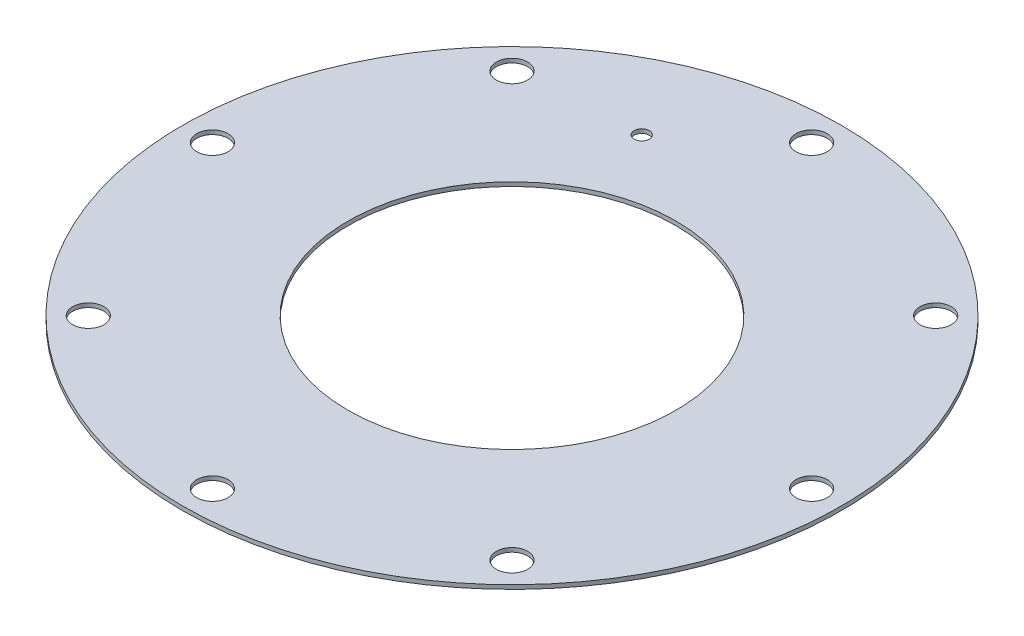
ISO-10303-21;
HEADER;
FILE_DESCRIPTION(('STEP AP214'),'2;1');
FILE_NAME('part.step','',(''),(''),'','','');
FILE_SCHEMA(('AUTOMOTIVE_DESIGN { 1 0 10303 214 1 1 1 1 }'));
ENDSEC;
DATA;
#1=APPLICATION_CONTEXT('core data for automotive mechanical design processes');
#2=APPLICATION_PROTOCOL_DEFINITION('international standard','automotive_design',2000,#1);
#3=PRODUCT_CONTEXT('',#1,'mechanical');
#4=PRODUCT('Part','Part','',(#3));
#5=PRODUCT_RELATED_PRODUCT_CATEGORY('part','',(#4));
#6=PRODUCT_DEFINITION_FORMATION('','',#4);
#7=PRODUCT_DEFINITION_CONTEXT('part definition',#1,'design');
#8=PRODUCT_DEFINITION('design','',#6,#7);
#9=PRODUCT_DEFINITION_SHAPE('','',#8);
#10=(LENGTH_UNIT() NAMED_UNIT(*) SI_UNIT(.MILLI.,.METRE.));
#11=(NAMED_UNIT(*) PLANE_ANGLE_UNIT() SI_UNIT($,.RADIAN.));
#12=(NAMED_UNIT(*) SI_UNIT($,.STERADIAN.) SOLID_ANGLE_UNIT());
#13=UNCERTAINTY_MEASURE_WITH_UNIT(LENGTH_MEASURE(1.E-05),#10,'distance_accuracy_value','');
#14=(GEOMETRIC_REPRESENTATION_CONTEXT(3) GLOBAL_UNCERTAINTY_ASSIGNED_CONTEXT((#13)) GLOBAL_UNIT_ASSIGNED_CONTEXT((#10,
#11,#12)) REPRESENTATION_CONTEXT('',''));
#15=CARTESIAN_POINT('',(0.,0.,0.));
#16=DIRECTION('',(0.,0.,1.));
#17=DIRECTION('',(1.,0.,0.));
#18=AXIS2_PLACEMENT_3D('',#15,#16,#17);
#19=CARTESIAN_POINT('',(0.,0.8636,0.));
#20=DIRECTION('',(0.,1.,0.));
#21=DIRECTION('',(0.,0.,1.));
#22=AXIS2_PLACEMENT_3D('',#19,#20,#21);
#23=PLANE('',#22);
#24=CARTESIAN_POINT('',(-63.4999999999946,0.8636,5.41044739290467E-12));
#25=DIRECTION('',(0.,1.,0.));
#26=DIRECTION('',(0.,0.,1.));
#27=AXIS2_PLACEMENT_3D('',#24,#25,#26);
#28=CIRCLE('',#27,3.31470000000739);
#29=CARTESIAN_POINT('',(-63.4999999999946,0.8636,3.3147000000128));
#30=VERTEX_POINT('',#29);
#31=EDGE_CURVE('E116',#30,#30,#28,.T.);
#32=ORIENTED_EDGE('',*,*,#31,.F.);
#33=EDGE_LOOP('',(#32));
#34=FACE_BOUND('',#33,.T.);
#35=CARTESIAN_POINT('',(1.08053417714602E-11,0.8636,63.5));
#36=DIRECTION('',(0.,1.,0.));
#37=DIRECTION('',(0.,0.,1.));
#38=AXIS2_PLACEMENT_3D('',#35,#36,#37);
#39=CIRCLE('',#38,3.31470000001075);
#40=CARTESIAN_POINT('',(1.08053417714602E-11,0.8636,66.8147000000108));
#41=VERTEX_POINT('',#40);
#42=EDGE_CURVE('E100',#41,#41,#39,.T.);
#43=ORIENTED_EDGE('',*,*,#42,.F.);
#44=EDGE_LOOP('',(#43));
#45=FACE_BOUND('',#44,.T.);
#46=CARTESIAN_POINT('',(63.5000000000054,0.8636,-5.40267088573009E-12));
#47=DIRECTION('',(0.,1.,0.));
#48=DIRECTION('',(0.,0.,1.));
#49=AXIS2_PLACEMENT_3D('',#46,#47,#48);
#50=CIRCLE('',#49,3.3147000000038);
#51=CARTESIAN_POINT('',(63.5000000000054,0.8636,3.3146999999984));
#52=VERTEX_POINT('',#51);
#53=EDGE_CURVE('E84',#52,#52,#50,.T.);
#54=ORIENTED_EDGE('',*,*,#53,.F.);
#55=EDGE_LOOP('',(#54));
#56=FACE_BOUND('',#55,.T.);
#57=CARTESIAN_POINT('',(-19.4403183641466,0.8636,-46.9330802515734));
#58=DIRECTION('',(0.,1.,0.));
#59=DIRECTION('',(0.,0.,1.));
#60=AXIS2_PLACEMENT_3D('',#57,#58,#59);
#61=CIRCLE('',#60,1.5875);
#62=CARTESIAN_POINT('',(-19.4403183641466,0.8636,-45.3455802515734));
#63=VERTEX_POINT('',#62);
#64=EDGE_CURVE('E68',#63,#63,#61,.T.);
#65=ORIENTED_EDGE('',*,*,#64,.F.);
#66=EDGE_LOOP('',(#65));
#67=FACE_BOUND('',#66,.T.);
#68=CARTESIAN_POINT('',(0.,0.8636,0.));
#69=DIRECTION('',(0.,1.,0.));
#70=DIRECTION('',(0.,0.,1.));
#71=AXIS2_PLACEMENT_3D('',#68,#69,#70);
#72=CIRCLE('',#71,34.7526);
#73=CARTESIAN_POINT('',(0.,0.8636,34.7526));
#74=VERTEX_POINT('',#73);
#75=EDGE_CURVE('E54',#74,#74,#72,.T.);
#76=ORIENTED_EDGE('',*,*,#75,.F.);
#77=EDGE_LOOP('',(#76));
#78=FACE_BOUND('',#77,.T.);
#79=CARTESIAN_POINT('',(0.,0.8636,0.));
#80=DIRECTION('',(0.,1.,0.));
#81=DIRECTION('',(0.,0.,1.));
#82=AXIS2_PLACEMENT_3D('',#79,#80,#81);
#83=CIRCLE('',#82,69.85);
#84=CARTESIAN_POINT('',(0.,0.8636,69.85));
#85=VERTEX_POINT('',#84);
#86=EDGE_CURVE('E10',#85,#85,#83,.T.);
#87=ORIENTED_EDGE('',*,*,#86,.T.);
#88=EDGE_LOOP('',(#87));
#89=FACE_BOUND('',#88,.T.);
#90=CARTESIAN_POINT('',(0.,0.8636,-63.5));
#91=DIRECTION('',(0.,1.,0.));
#92=DIRECTION('',(0.,0.,1.));
#93=AXIS2_PLACEMENT_3D('',#90,#91,#92);
#94=CIRCLE('',#93,3.3147);
#95=CARTESIAN_POINT('',(0.,0.8636,-60.1853));
#96=VERTEX_POINT('',#95);
#97=EDGE_CURVE('E60',#96,#96,#94,.T.);
#98=ORIENTED_EDGE('',*,*,#97,.F.);
#99=EDGE_LOOP('',(#98));
#100=FACE_BOUND('',#99,.T.);
#101=CARTESIAN_POINT('',(44.9012806053473,0.8636,-44.9012806053496));
#102=DIRECTION('',(0.,1.,0.));
#103=DIRECTION('',(0.,0.,1.));
#104=AXIS2_PLACEMENT_3D('',#101,#102,#103);
#105=CIRCLE('',#104,3.31470000000052);
#106=CARTESIAN_POINT('',(44.9012806053473,0.8636,-41.5865806053491));
#107=VERTEX_POINT('',#106);
#108=EDGE_CURVE('E76',#107,#107,#105,.T.);
#109=ORIENTED_EDGE('',*,*,#108,.F.);
#110=EDGE_LOOP('',(#109));
#111=FACE_BOUND('',#110,.T.);
#112=CARTESIAN_POINT('',(44.901280605355,0.8636,44.9012806053419));
#113=DIRECTION('',(0.,1.,0.));
#114=DIRECTION('',(0.,0.,1.));
#115=AXIS2_PLACEMENT_3D('',#112,#113,#114);
#116=CIRCLE('',#115,3.31470000000801);
#117=CARTESIAN_POINT('',(44.901280605355,0.8636,48.21598060535));
#118=VERTEX_POINT('',#117);
#119=EDGE_CURVE('E92',#118,#118,#116,.T.);
#120=ORIENTED_EDGE('',*,*,#119,.F.);
#121=EDGE_LOOP('',(#120));
#122=FACE_BOUND('',#121,.T.);
#123=CARTESIAN_POINT('',(-44.9012806053365,0.8636,44.9012806053496));
#124=DIRECTION('',(0.,1.,0.));
#125=DIRECTION('',(0.,0.,1.));
#126=AXIS2_PLACEMENT_3D('',#123,#124,#125);
#127=CIRCLE('',#126,3.31470000001046);
#128=CARTESIAN_POINT('',(-44.9012806053365,0.8636,48.2159806053601));
#129=VERTEX_POINT('',#128);
#130=EDGE_CURVE('E108',#129,#129,#127,.T.);
#131=ORIENTED_EDGE('',*,*,#130,.F.);
#132=EDGE_LOOP('',(#131));
#133=FACE_BOUND('',#132,.T.);
#134=CARTESIAN_POINT('',(-44.9012806053442,0.8636,-44.9012806053419));
#135=DIRECTION('',(0.,1.,0.));
#136=DIRECTION('',(0.,0.,1.));
#137=AXIS2_PLACEMENT_3D('',#134,#135,#136);
#138=CIRCLE('',#137,3.31470000000339);
#139=CARTESIAN_POINT('',(-44.9012806053442,0.8636,-41.5865806053385));
#140=VERTEX_POINT('',#139);
#141=EDGE_CURVE('E124',#140,#140,#138,.T.);
#142=ORIENTED_EDGE('',*,*,#141,.F.);
#143=EDGE_LOOP('',(#142));
#144=FACE_BOUND('',#143,.T.);
#145=ADVANCED_FACE('F41',(#34,#45,#56,#67,#78,#89,#100,#111,#122,#133,#144),#23,.T.);
#146=CARTESIAN_POINT('',(0.,0.,0.));
#147=DIRECTION('',(0.,1.,0.));
#148=DIRECTION('',(0.,0.,1.));
#149=AXIS2_PLACEMENT_3D('',#146,#147,#148);
#150=PLANE('',#149);
#151=CARTESIAN_POINT('',(0.,0.,0.));
#152=DIRECTION('',(0.,1.,0.));
#153=DIRECTION('',(0.,0.,1.));
#154=AXIS2_PLACEMENT_3D('',#151,#152,#153);
#155=CIRCLE('',#154,69.85);
#156=CARTESIAN_POINT('',(0.,0.,69.85));
#157=VERTEX_POINT('',#156);
#158=EDGE_CURVE('E45',#157,#157,#155,.T.);
#159=ORIENTED_EDGE('',*,*,#158,.F.);
#160=EDGE_LOOP('',(#159));
#161=FACE_BOUND('',#160,.T.);
#162=CARTESIAN_POINT('',(0.,0.,0.));
#163=DIRECTION('',(0.,1.,0.));
#164=DIRECTION('',(0.,0.,1.));
#165=AXIS2_PLACEMENT_3D('',#162,#163,#164);
#166=CIRCLE('',#165,34.7526);
#167=CARTESIAN_POINT('',(0.,0.,34.7526));
#168=VERTEX_POINT('',#167);
#169=EDGE_CURVE('E56',#168,#168,#166,.T.);
#170=ORIENTED_EDGE('',*,*,#169,.T.);
#171=EDGE_LOOP('',(#170));
#172=FACE_BOUND('',#171,.T.);
#173=CARTESIAN_POINT('',(0.,0.,-63.5));
#174=DIRECTION('',(0.,1.,0.));
#175=DIRECTION('',(0.,0.,1.));
#176=AXIS2_PLACEMENT_3D('',#173,#174,#175);
#177=CIRCLE('',#176,3.3147);
#178=CARTESIAN_POINT('',(0.,0.,-60.1853));
#179=VERTEX_POINT('',#178);
#180=EDGE_CURVE('E64',#179,#179,#177,.T.);
#181=ORIENTED_EDGE('',*,*,#180,.T.);
#182=EDGE_LOOP('',(#181));
#183=FACE_BOUND('',#182,.T.);
#184=CARTESIAN_POINT('',(-19.4403183641466,0.,-46.9330802515734));
#185=DIRECTION('',(0.,1.,0.));
#186=DIRECTION('',(0.,0.,1.));
#187=AXIS2_PLACEMENT_3D('',#184,#185,#186);
#188=CIRCLE('',#187,1.5875);
#189=CARTESIAN_POINT('',(-19.4403183641466,0.,-45.3455802515734));
#190=VERTEX_POINT('',#189);
#191=EDGE_CURVE('E72',#190,#190,#188,.T.);
#192=ORIENTED_EDGE('',*,*,#191,.T.);
#193=EDGE_LOOP('',(#192));
#194=FACE_BOUND('',#193,.T.);
#195=CARTESIAN_POINT('',(44.9012806053473,0.,-44.9012806053496));
#196=DIRECTION('',(0.,1.,0.));
#197=DIRECTION('',(0.,0.,1.));
#198=AXIS2_PLACEMENT_3D('',#195,#196,#197);
#199=CIRCLE('',#198,3.31470000000052);
#200=CARTESIAN_POINT('',(44.9012806053473,0.,-41.5865806053491));
#201=VERTEX_POINT('',#200);
#202=EDGE_CURVE('E80',#201,#201,#199,.T.);
#203=ORIENTED_EDGE('',*,*,#202,.T.);
#204=EDGE_LOOP('',(#203));
#205=FACE_BOUND('',#204,.T.);
#206=CARTESIAN_POINT('',(63.5000000000054,0.,-5.40267088573009E-12));
#207=DIRECTION('',(0.,1.,0.));
#208=DIRECTION('',(0.,0.,1.));
#209=AXIS2_PLACEMENT_3D('',#206,#207,#208);
#210=CIRCLE('',#209,3.3147000000038);
#211=CARTESIAN_POINT('',(63.5000000000054,0.,3.3146999999984));
#212=VERTEX_POINT('',#211);
#213=EDGE_CURVE('E88',#212,#212,#210,.T.);
#214=ORIENTED_EDGE('',*,*,#213,.T.);
#215=EDGE_LOOP('',(#214));
#216=FACE_BOUND('',#215,.T.);
#217=CARTESIAN_POINT('',(44.901280605355,0.,44.9012806053419));
#218=DIRECTION('',(0.,1.,0.));
#219=DIRECTION('',(0.,0.,1.));
#220=AXIS2_PLACEMENT_3D('',#217,#218,#219);
#221=CIRCLE('',#220,3.31470000000801);
#222=CARTESIAN_POINT('',(44.901280605355,0.,48.21598060535));
#223=VERTEX_POINT('',#222);
#224=EDGE_CURVE('E96',#223,#223,#221,.T.);
#225=ORIENTED_EDGE('',*,*,#224,.T.);
#226=EDGE_LOOP('',(#225));
#227=FACE_BOUND('',#226,.T.);
#228=CARTESIAN_POINT('',(1.08053417714602E-11,0.,63.5));
#229=DIRECTION('',(0.,1.,0.));
#230=DIRECTION('',(0.,0.,1.));
#231=AXIS2_PLACEMENT_3D('',#228,#229,#230);
#232=CIRCLE('',#231,3.31470000001075);
#233=CARTESIAN_POINT('',(1.08053417714602E-11,0.,66.8147000000108));
#234=VERTEX_POINT('',#233);
#235=EDGE_CURVE('E104',#234,#234,#232,.T.);
#236=ORIENTED_EDGE('',*,*,#235,.T.);
#237=EDGE_LOOP('',(#236));
#238=FACE_BOUND('',#237,.T.);
#239=CARTESIAN_POINT('',(-44.9012806053365,0.,44.9012806053496));
#240=DIRECTION('',(0.,1.,0.));
#241=DIRECTION('',(0.,0.,1.));
#242=AXIS2_PLACEMENT_3D('',#239,#240,#241);
#243=CIRCLE('',#242,3.31470000001046);
#244=CARTESIAN_POINT('',(-44.9012806053365,0.,48.2159806053601));
#245=VERTEX_POINT('',#244);
#246=EDGE_CURVE('E112',#245,#245,#243,.T.);
#247=ORIENTED_EDGE('',*,*,#246,.T.);
#248=EDGE_LOOP('',(#247));
#249=FACE_BOUND('',#248,.T.);
#250=CARTESIAN_POINT('',(-63.4999999999946,0.,5.41044739290467E-12));
#251=DIRECTION('',(0.,1.,0.));
#252=DIRECTION('',(0.,0.,1.));
#253=AXIS2_PLACEMENT_3D('',#250,#251,#252);
#254=CIRCLE('',#253,3.31470000000739);
#255=CARTESIAN_POINT('',(-63.4999999999946,0.,3.3147000000128));
#256=VERTEX_POINT('',#255);
#257=EDGE_CURVE('E120',#256,#256,#254,.T.);
#258=ORIENTED_EDGE('',*,*,#257,.T.);
#259=EDGE_LOOP('',(#258));
#260=FACE_BOUND('',#259,.T.);
#261=CARTESIAN_POINT('',(-44.9012806053442,0.,-44.9012806053419));
#262=DIRECTION('',(0.,1.,0.));
#263=DIRECTION('',(0.,0.,1.));
#264=AXIS2_PLACEMENT_3D('',#261,#262,#263);
#265=CIRCLE('',#264,3.31470000000339);
#266=CARTESIAN_POINT('',(-44.9012806053442,0.,-41.5865806053385));
#267=VERTEX_POINT('',#266);
#268=EDGE_CURVE('E128',#267,#267,#265,.T.);
#269=ORIENTED_EDGE('',*,*,#268,.T.);
#270=EDGE_LOOP('',(#269));
#271=FACE_BOUND('',#270,.T.);
#272=ADVANCED_FACE('F140',(#161,#172,#183,#194,#205,#216,#227,#238,#249,#260,#271),#150,.F.);
#273=CARTESIAN_POINT('',(0.,0.8636,0.));
#274=DIRECTION('',(0.,-1.,0.));
#275=DIRECTION('',(0.,0.,-1.));
#276=AXIS2_PLACEMENT_3D('',#273,#274,#275);
#277=CYLINDRICAL_SURFACE('',#276,69.85);
#278=ORIENTED_EDGE('',*,*,#86,.F.);
#279=EDGE_LOOP('',(#278));
#280=FACE_BOUND('',#279,.T.);
#281=ORIENTED_EDGE('',*,*,#158,.T.);
#282=EDGE_LOOP('',(#281));
#283=FACE_BOUND('',#282,.T.);
#284=ADVANCED_FACE('F43',(#280,#283),#277,.T.);
#285=CARTESIAN_POINT('',(0.,0.8636,0.));
#286=DIRECTION('',(0.,-1.,0.));
#287=DIRECTION('',(0.,0.,-1.));
#288=AXIS2_PLACEMENT_3D('',#285,#286,#287);
#289=CYLINDRICAL_SURFACE('',#288,34.7526);
#290=ORIENTED_EDGE('',*,*,#75,.T.);
#291=EDGE_LOOP('',(#290));
#292=FACE_BOUND('',#291,.T.);
#293=ORIENTED_EDGE('',*,*,#169,.F.);
#294=EDGE_LOOP('',(#293));
#295=FACE_BOUND('',#294,.T.);
#296=ADVANCED_FACE('F150',(#292,#295),#289,.F.);
#297=CARTESIAN_POINT('',(0.,0.8636,-63.5));
#298=DIRECTION('',(0.,-1.,0.));
#299=DIRECTION('',(0.,0.,-1.));
#300=AXIS2_PLACEMENT_3D('',#297,#298,#299);
#301=CYLINDRICAL_SURFACE('',#300,3.3147);
#302=ORIENTED_EDGE('',*,*,#97,.T.);
#303=EDGE_LOOP('',(#302));
#304=FACE_BOUND('',#303,.T.);
#305=ORIENTED_EDGE('',*,*,#180,.F.);
#306=EDGE_LOOP('',(#305));
#307=FACE_BOUND('',#306,.T.);
#308=ADVANCED_FACE('F153',(#304,#307),#301,.F.);
#309=CARTESIAN_POINT('',(-19.4403183641466,0.8636,-46.9330802515734));
#310=DIRECTION('',(0.,-1.,0.));
#311=DIRECTION('',(0.,0.,-1.));
#312=AXIS2_PLACEMENT_3D('',#309,#310,#311);
#313=CYLINDRICAL_SURFACE('',#312,1.5875);
#314=ORIENTED_EDGE('',*,*,#64,.T.);
#315=EDGE_LOOP('',(#314));
#316=FACE_BOUND('',#315,.T.);
#317=ORIENTED_EDGE('',*,*,#191,.F.);
#318=EDGE_LOOP('',(#317));
#319=FACE_BOUND('',#318,.T.);
#320=ADVANCED_FACE('F157',(#316,#319),#313,.F.);
#321=CARTESIAN_POINT('',(44.9012806053473,0.8636,-44.9012806053496));
#322=DIRECTION('',(0.,-1.,0.));
#323=DIRECTION('',(0.,0.,-1.));
#324=AXIS2_PLACEMENT_3D('',#321,#322,#323);
#325=CYLINDRICAL_SURFACE('',#324,3.31470000000052);
#326=ORIENTED_EDGE('',*,*,#108,.T.);
#327=EDGE_LOOP('',(#326));
#328=FACE_BOUND('',#327,.T.);
#329=ORIENTED_EDGE('',*,*,#202,.F.);
#330=EDGE_LOOP('',(#329));
#331=FACE_BOUND('',#330,.T.);
#332=ADVANCED_FACE('F161',(#328,#331),#325,.F.);
#333=CARTESIAN_POINT('',(63.5000000000054,0.8636,-5.40267088573009E-12));
#334=DIRECTION('',(0.,-1.,0.));
#335=DIRECTION('',(0.,0.,-1.));
#336=AXIS2_PLACEMENT_3D('',#333,#334,#335);
#337=CYLINDRICAL_SURFACE('',#336,3.3147000000038);
#338=ORIENTED_EDGE('',*,*,#53,.T.);
#339=EDGE_LOOP('',(#338));
#340=FACE_BOUND('',#339,.T.);
#341=ORIENTED_EDGE('',*,*,#213,.F.);
#342=EDGE_LOOP('',(#341));
#343=FACE_BOUND('',#342,.T.);
#344=ADVANCED_FACE('F165',(#340,#343),#337,.F.);
#345=CARTESIAN_POINT('',(44.901280605355,0.8636,44.9012806053419));
#346=DIRECTION('',(0.,-1.,0.));
#347=DIRECTION('',(0.,0.,-1.));
#348=AXIS2_PLACEMENT_3D('',#345,#346,#347);
#349=CYLINDRICAL_SURFACE('',#348,3.31470000000801);
#350=ORIENTED_EDGE('',*,*,#119,.T.);
#351=EDGE_LOOP('',(#350));
#352=FACE_BOUND('',#351,.T.);
#353=ORIENTED_EDGE('',*,*,#224,.F.);
#354=EDGE_LOOP('',(#353));
#355=FACE_BOUND('',#354,.T.);
#356=ADVANCED_FACE('F169',(#352,#355),#349,.F.);
#357=CARTESIAN_POINT('',(1.08053417714602E-11,0.8636,63.5));
#358=DIRECTION('',(0.,-1.,0.));
#359=DIRECTION('',(0.,0.,-1.));
#360=AXIS2_PLACEMENT_3D('',#357,#358,#359);
#361=CYLINDRICAL_SURFACE('',#360,3.31470000001075);
#362=ORIENTED_EDGE('',*,*,#42,.T.);
#363=EDGE_LOOP('',(#362));
#364=FACE_BOUND('',#363,.T.);
#365=ORIENTED_EDGE('',*,*,#235,.F.);
#366=EDGE_LOOP('',(#365));
#367=FACE_BOUND('',#366,.T.);
#368=ADVANCED_FACE('F173',(#364,#367),#361,.F.);
#369=CARTESIAN_POINT('',(-44.9012806053365,0.8636,44.9012806053496));
#370=DIRECTION('',(0.,-1.,0.));
#371=DIRECTION('',(0.,0.,-1.));
#372=AXIS2_PLACEMENT_3D('',#369,#370,#371);
#373=CYLINDRICAL_SURFACE('',#372,3.31470000001046);
#374=ORIENTED_EDGE('',*,*,#130,.T.);
#375=EDGE_LOOP('',(#374));
#376=FACE_BOUND('',#375,.T.);
#377=ORIENTED_EDGE('',*,*,#246,.F.);
#378=EDGE_LOOP('',(#377));
#379=FACE_BOUND('',#378,.T.);
#380=ADVANCED_FACE('F177',(#376,#379),#373,.F.);
#381=CARTESIAN_POINT('',(-63.4999999999946,0.8636,5.41044739290467E-12));
#382=DIRECTION('',(0.,-1.,0.));
#383=DIRECTION('',(0.,0.,-1.));
#384=AXIS2_PLACEMENT_3D('',#381,#382,#383);
#385=CYLINDRICAL_SURFACE('',#384,3.31470000000739);
#386=ORIENTED_EDGE('',*,*,#31,.T.);
#387=EDGE_LOOP('',(#386));
#388=FACE_BOUND('',#387,.T.);
#389=ORIENTED_EDGE('',*,*,#257,.F.);
#390=EDGE_LOOP('',(#389));
#391=FACE_BOUND('',#390,.T.);
#392=ADVANCED_FACE('F181',(#388,#391),#385,.F.);
#393=CARTESIAN_POINT('',(-44.9012806053442,0.8636,-44.9012806053419));
#394=DIRECTION('',(0.,-1.,0.));
#395=DIRECTION('',(0.,0.,-1.));
#396=AXIS2_PLACEMENT_3D('',#393,#394,#395);
#397=CYLINDRICAL_SURFACE('',#396,3.31470000000339);
#398=ORIENTED_EDGE('',*,*,#141,.T.);
#399=EDGE_LOOP('',(#398));
#400=FACE_BOUND('',#399,.T.);
#401=ORIENTED_EDGE('',*,*,#268,.F.);
#402=EDGE_LOOP('',(#401));
#403=FACE_BOUND('',#402,.T.);
#404=ADVANCED_FACE('F136',(#400,#403),#397,.F.);
#405=CLOSED_SHELL('',(#145,#272,#284,#296,#308,#320,#332,#344,#356,#368,#380,#392,#404));
#406=MANIFOLD_SOLID_BREP('B2',#405);
#407=ADVANCED_BREP_SHAPE_REPRESENTATION('',(#18,#406),#14);
#408=SHAPE_DEFINITION_REPRESENTATION(#9,#407);
ENDSEC;
END-ISO-10303-21;
